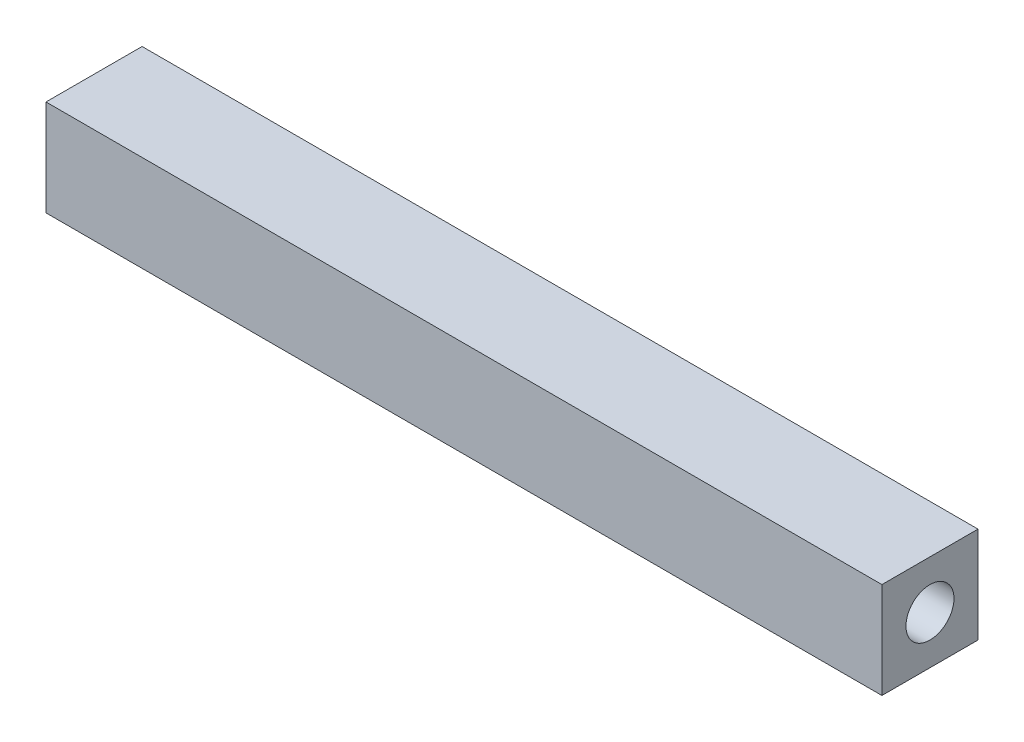
ISO-10303-21;
HEADER;
FILE_DESCRIPTION(('STEP AP214'),'2;1');
FILE_NAME('part.step','',(''),(''),'','','');
FILE_SCHEMA(('AUTOMOTIVE_DESIGN { 1 0 10303 214 1 1 1 1 }'));
ENDSEC;
DATA;
#1=APPLICATION_CONTEXT('core data for automotive mechanical design processes');
#2=APPLICATION_PROTOCOL_DEFINITION('international standard','automotive_design',2000,#1);
#3=PRODUCT_CONTEXT('',#1,'mechanical');
#4=PRODUCT('Part','Part','',(#3));
#5=PRODUCT_RELATED_PRODUCT_CATEGORY('part','',(#4));
#6=PRODUCT_DEFINITION_FORMATION('','',#4);
#7=PRODUCT_DEFINITION_CONTEXT('part definition',#1,'design');
#8=PRODUCT_DEFINITION('design','',#6,#7);
#9=PRODUCT_DEFINITION_SHAPE('','',#8);
#10=(LENGTH_UNIT() NAMED_UNIT(*) SI_UNIT(.MILLI.,.METRE.));
#11=(NAMED_UNIT(*) PLANE_ANGLE_UNIT() SI_UNIT($,.RADIAN.));
#12=(NAMED_UNIT(*) SI_UNIT($,.STERADIAN.) SOLID_ANGLE_UNIT());
#13=UNCERTAINTY_MEASURE_WITH_UNIT(LENGTH_MEASURE(1.E-05),#10,'distance_accuracy_value','');
#14=(GEOMETRIC_REPRESENTATION_CONTEXT(3) GLOBAL_UNCERTAINTY_ASSIGNED_CONTEXT((#13)) GLOBAL_UNIT_ASSIGNED_CONTEXT((#10,
#11,#12)) REPRESENTATION_CONTEXT('',''));
#15=CARTESIAN_POINT('',(0.,0.,0.));
#16=DIRECTION('',(0.,0.,1.));
#17=DIRECTION('',(1.,0.,0.));
#18=AXIS2_PLACEMENT_3D('',#15,#16,#17);
#19=CARTESIAN_POINT('',(43.5,10.,5.));
#20=DIRECTION('',(-1.,0.,0.));
#21=DIRECTION('',(0.,0.,1.));
#22=AXIS2_PLACEMENT_3D('',#19,#20,#21);
#23=PLANE('',#22);
#24=CARTESIAN_POINT('',(43.5,5.,-1.81105130891979E-13));
#25=DIRECTION('',(1.,0.,0.));
#26=DIRECTION('',(0.,0.,-1.));
#27=AXIS2_PLACEMENT_3D('',#24,#25,#26);
#28=CIRCLE('',#27,2.5);
#29=CARTESIAN_POINT('',(43.5,5.,-2.50000000000018));
#30=VERTEX_POINT('',#29);
#31=EDGE_CURVE('E117',#30,#30,#28,.T.);
#32=ORIENTED_EDGE('',*,*,#31,.F.);
#33=EDGE_LOOP('',(#32));
#34=FACE_BOUND('',#33,.T.);
#35=DIRECTION('',(0.,0.,-1.));
#36=VECTOR('',#35,1.);
#37=CARTESIAN_POINT('',(43.5,0.,5.));
#38=LINE('',#37,#36);
#39=CARTESIAN_POINT('',(43.5,0.,5.));
#40=VERTEX_POINT('',#39);
#41=CARTESIAN_POINT('',(43.5,0.,-5.));
#42=VERTEX_POINT('',#41);
#43=EDGE_CURVE('E105',#40,#42,#38,.T.);
#44=ORIENTED_EDGE('',*,*,#43,.T.);
#45=DIRECTION('',(0.,-1.,0.));
#46=VECTOR('',#45,1.);
#47=CARTESIAN_POINT('',(43.5,10.,-5.));
#48=LINE('',#47,#46);
#49=CARTESIAN_POINT('',(43.5,10.,-5.));
#50=VERTEX_POINT('',#49);
#51=EDGE_CURVE('E11',#50,#42,#48,.T.);
#52=ORIENTED_EDGE('',*,*,#51,.F.);
#53=DIRECTION('',(0.,0.,-1.));
#54=VECTOR('',#53,1.);
#55=CARTESIAN_POINT('',(43.5,10.,5.));
#56=LINE('',#55,#54);
#57=CARTESIAN_POINT('',(43.5,10.,5.));
#58=VERTEX_POINT('',#57);
#59=EDGE_CURVE('E89',#58,#50,#56,.T.);
#60=ORIENTED_EDGE('',*,*,#59,.F.);
#61=DIRECTION('',(0.,-1.,0.));
#62=VECTOR('',#61,1.);
#63=CARTESIAN_POINT('',(43.5,10.,5.));
#64=LINE('',#63,#62);
#65=EDGE_CURVE('E98',#58,#40,#64,.T.);
#66=ORIENTED_EDGE('',*,*,#65,.T.);
#67=EDGE_LOOP('',(#44,#52,#60,#66));
#68=FACE_BOUND('',#67,.T.);
#69=ADVANCED_FACE('F39',(#34,#68),#23,.F.);
#70=CARTESIAN_POINT('',(-43.5,10.,-5.));
#71=DIRECTION('',(0.,0.,1.));
#72=DIRECTION('',(1.,0.,0.));
#73=AXIS2_PLACEMENT_3D('',#70,#71,#72);
#74=PLANE('',#73);
#75=DIRECTION('',(-1.,0.,0.));
#76=VECTOR('',#75,1.);
#77=CARTESIAN_POINT('',(-43.5,0.,-5.));
#78=LINE('',#77,#76);
#79=CARTESIAN_POINT('',(-43.5,0.,-5.));
#80=VERTEX_POINT('',#79);
#81=EDGE_CURVE('E94',#42,#80,#78,.T.);
#82=ORIENTED_EDGE('',*,*,#81,.T.);
#83=DIRECTION('',(0.,-1.,0.));
#84=VECTOR('',#83,1.);
#85=CARTESIAN_POINT('',(-43.5,10.,-5.));
#86=LINE('',#85,#84);
#87=CARTESIAN_POINT('',(-43.5,10.,-5.));
#88=VERTEX_POINT('',#87);
#89=EDGE_CURVE('E50',#88,#80,#86,.T.);
#90=ORIENTED_EDGE('',*,*,#89,.F.);
#91=DIRECTION('',(-1.,0.,0.));
#92=VECTOR('',#91,1.);
#93=CARTESIAN_POINT('',(-43.5,10.,-5.));
#94=LINE('',#93,#92);
#95=EDGE_CURVE('E84',#50,#88,#94,.T.);
#96=ORIENTED_EDGE('',*,*,#95,.F.);
#97=ORIENTED_EDGE('',*,*,#51,.T.);
#98=EDGE_LOOP('',(#82,#90,#96,#97));
#99=FACE_BOUND('',#98,.T.);
#100=ADVANCED_FACE('F91',(#99),#74,.F.);
#101=CARTESIAN_POINT('',(-43.5,10.,5.));
#102=DIRECTION('',(1.,0.,0.));
#103=DIRECTION('',(0.,0.,-1.));
#104=AXIS2_PLACEMENT_3D('',#101,#102,#103);
#105=PLANE('',#104);
#106=CARTESIAN_POINT('',(-43.5,5.,-1.81105130891979E-13));
#107=DIRECTION('',(1.,0.,0.));
#108=DIRECTION('',(0.,0.,-1.));
#109=AXIS2_PLACEMENT_3D('',#106,#107,#108);
#110=CIRCLE('',#109,2.5);
#111=CARTESIAN_POINT('',(-43.5,5.,-2.50000000000018));
#112=VERTEX_POINT('',#111);
#113=EDGE_CURVE('E125',#112,#112,#110,.T.);
#114=ORIENTED_EDGE('',*,*,#113,.T.);
#115=EDGE_LOOP('',(#114));
#116=FACE_BOUND('',#115,.T.);
#117=DIRECTION('',(0.,0.,1.));
#118=VECTOR('',#117,1.);
#119=CARTESIAN_POINT('',(-43.5,0.,5.));
#120=LINE('',#119,#118);
#121=CARTESIAN_POINT('',(-43.5,0.,5.));
#122=VERTEX_POINT('',#121);
#123=EDGE_CURVE('E75',#80,#122,#120,.T.);
#124=ORIENTED_EDGE('',*,*,#123,.T.);
#125=DIRECTION('',(0.,-1.,0.));
#126=VECTOR('',#125,1.);
#127=CARTESIAN_POINT('',(-43.5,10.,5.));
#128=LINE('',#127,#126);
#129=CARTESIAN_POINT('',(-43.5,10.,5.));
#130=VERTEX_POINT('',#129);
#131=EDGE_CURVE('E92',#130,#122,#128,.T.);
#132=ORIENTED_EDGE('',*,*,#131,.F.);
#133=DIRECTION('',(0.,0.,1.));
#134=VECTOR('',#133,1.);
#135=CARTESIAN_POINT('',(-43.5,10.,5.));
#136=LINE('',#135,#134);
#137=EDGE_CURVE('E86',#88,#130,#136,.T.);
#138=ORIENTED_EDGE('',*,*,#137,.F.);
#139=ORIENTED_EDGE('',*,*,#89,.T.);
#140=EDGE_LOOP('',(#124,#132,#138,#139));
#141=FACE_BOUND('',#140,.T.);
#142=ADVANCED_FACE('F96',(#116,#141),#105,.F.);
#143=CARTESIAN_POINT('',(-43.5,10.,5.));
#144=DIRECTION('',(0.,0.,-1.));
#145=DIRECTION('',(-1.,0.,0.));
#146=AXIS2_PLACEMENT_3D('',#143,#144,#145);
#147=PLANE('',#146);
#148=DIRECTION('',(1.,0.,0.));
#149=VECTOR('',#148,1.);
#150=CARTESIAN_POINT('',(-43.5,0.,5.));
#151=LINE('',#150,#149);
#152=EDGE_CURVE('E79',#122,#40,#151,.T.);
#153=ORIENTED_EDGE('',*,*,#152,.T.);
#154=ORIENTED_EDGE('',*,*,#65,.F.);
#155=DIRECTION('',(1.,0.,0.));
#156=VECTOR('',#155,1.);
#157=CARTESIAN_POINT('',(-43.5,10.,5.));
#158=LINE('',#157,#156);
#159=EDGE_CURVE('E54',#130,#58,#158,.T.);
#160=ORIENTED_EDGE('',*,*,#159,.F.);
#161=ORIENTED_EDGE('',*,*,#131,.T.);
#162=EDGE_LOOP('',(#153,#154,#160,#161));
#163=FACE_BOUND('',#162,.T.);
#164=ADVANCED_FACE('F109',(#163),#147,.F.);
#165=CARTESIAN_POINT('',(0.,10.,0.));
#166=DIRECTION('',(0.,-1.,0.));
#167=DIRECTION('',(0.,0.,-1.));
#168=AXIS2_PLACEMENT_3D('',#165,#166,#167);
#169=PLANE('',#168);
#170=ORIENTED_EDGE('',*,*,#59,.T.);
#171=ORIENTED_EDGE('',*,*,#95,.T.);
#172=ORIENTED_EDGE('',*,*,#137,.T.);
#173=ORIENTED_EDGE('',*,*,#159,.T.);
#174=EDGE_LOOP('',(#170,#171,#172,#173));
#175=FACE_BOUND('',#174,.T.);
#176=ADVANCED_FACE('F88',(#175),#169,.F.);
#177=CARTESIAN_POINT('',(0.,0.,0.));
#178=DIRECTION('',(0.,-1.,0.));
#179=DIRECTION('',(0.,0.,-1.));
#180=AXIS2_PLACEMENT_3D('',#177,#178,#179);
#181=PLANE('',#180);
#182=ORIENTED_EDGE('',*,*,#43,.F.);
#183=ORIENTED_EDGE('',*,*,#152,.F.);
#184=ORIENTED_EDGE('',*,*,#123,.F.);
#185=ORIENTED_EDGE('',*,*,#81,.F.);
#186=EDGE_LOOP('',(#182,#183,#184,#185));
#187=FACE_BOUND('',#186,.T.);
#188=ADVANCED_FACE('F114',(#187),#181,.T.);
#189=CARTESIAN_POINT('',(39.5,5.,-1.64451785522601E-13));
#190=DIRECTION('',(1.,0.,0.));
#191=DIRECTION('',(0.,0.,-1.));
#192=AXIS2_PLACEMENT_3D('',#189,#190,#191);
#193=CYLINDRICAL_SURFACE('',#192,2.5);
#194=CARTESIAN_POINT('',(39.5,5.,-1.64451785522601E-13));
#195=DIRECTION('',(1.,0.,0.));
#196=DIRECTION('',(0.,0.,-1.));
#197=AXIS2_PLACEMENT_3D('',#194,#195,#196);
#198=CIRCLE('',#197,2.5);
#199=CARTESIAN_POINT('',(39.5,5.,-2.50000000000016));
#200=VERTEX_POINT('',#199);
#201=EDGE_CURVE('E104',#200,#200,#198,.T.);
#202=ORIENTED_EDGE('',*,*,#201,.F.);
#203=EDGE_LOOP('',(#202));
#204=FACE_BOUND('',#203,.T.);
#205=ORIENTED_EDGE('',*,*,#31,.T.);
#206=EDGE_LOOP('',(#205));
#207=FACE_BOUND('',#206,.T.);
#208=ADVANCED_FACE('F146',(#204,#207),#193,.F.);
#209=CARTESIAN_POINT('',(39.5,5.,-1.64451785522601E-13));
#210=DIRECTION('',(1.,0.,0.));
#211=DIRECTION('',(0.,0.,-1.));
#212=AXIS2_PLACEMENT_3D('',#209,#210,#211);
#213=PLANE('',#212);
#214=ORIENTED_EDGE('',*,*,#201,.T.);
#215=EDGE_LOOP('',(#214));
#216=FACE_BOUND('',#215,.T.);
#217=ADVANCED_FACE('F140',(#216),#213,.T.);
#218=CARTESIAN_POINT('',(-39.5,5.,-1.64451785522601E-13));
#219=DIRECTION('',(-1.,0.,0.));
#220=DIRECTION('',(0.,0.,1.));
#221=AXIS2_PLACEMENT_3D('',#218,#219,#220);
#222=CYLINDRICAL_SURFACE('',#221,2.5);
#223=CARTESIAN_POINT('',(-39.5,5.,-1.64451785522601E-13));
#224=DIRECTION('',(1.,0.,0.));
#225=DIRECTION('',(0.,0.,-1.));
#226=AXIS2_PLACEMENT_3D('',#223,#224,#225);
#227=CIRCLE('',#226,2.5);
#228=CARTESIAN_POINT('',(-39.5,5.,-2.50000000000016));
#229=VERTEX_POINT('',#228);
#230=EDGE_CURVE('E116',#229,#229,#227,.T.);
#231=ORIENTED_EDGE('',*,*,#230,.T.);
#232=EDGE_LOOP('',(#231));
#233=FACE_BOUND('',#232,.T.);
#234=ORIENTED_EDGE('',*,*,#113,.F.);
#235=EDGE_LOOP('',(#234));
#236=FACE_BOUND('',#235,.T.);
#237=ADVANCED_FACE('F126',(#233,#236),#222,.F.);
#238=CARTESIAN_POINT('',(-39.5,5.,-1.64451785522601E-13));
#239=DIRECTION('',(-1.,0.,0.));
#240=DIRECTION('',(0.,0.,-1.));
#241=AXIS2_PLACEMENT_3D('',#238,#239,#240);
#242=PLANE('',#241);
#243=ORIENTED_EDGE('',*,*,#230,.F.);
#244=EDGE_LOOP('',(#243));
#245=FACE_BOUND('',#244,.T.);
#246=ADVANCED_FACE('F132',(#245),#242,.T.);
#247=CLOSED_SHELL('',(#69,#100,#142,#164,#176,#188,#208,#217,#237,#246));
#248=MANIFOLD_SOLID_BREP('B2',#247);
#249=ADVANCED_BREP_SHAPE_REPRESENTATION('',(#18,#248),#14);
#250=SHAPE_DEFINITION_REPRESENTATION(#9,#249);
ENDSEC;
END-ISO-10303-21;
